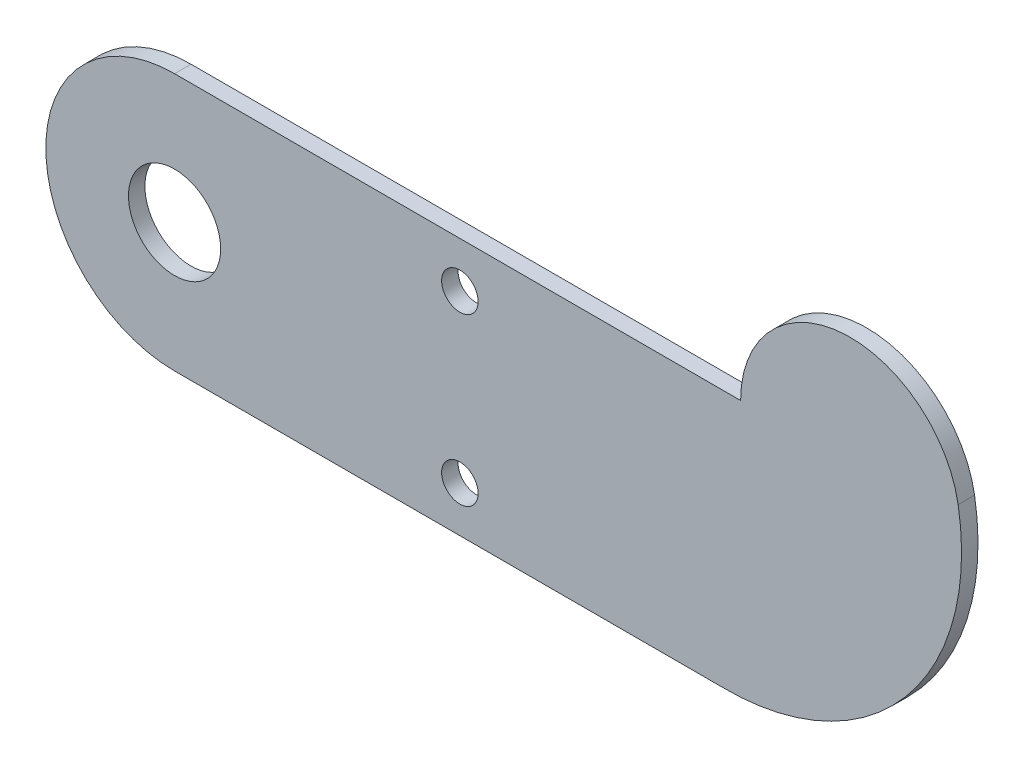
ISO-10303-21;
HEADER;
FILE_DESCRIPTION(('STEP AP214'),'2;1');
FILE_NAME('part.step','',(''),(''),'','','');
FILE_SCHEMA(('AUTOMOTIVE_DESIGN { 1 0 10303 214 1 1 1 1 }'));
ENDSEC;
DATA;
#1=APPLICATION_CONTEXT('core data for automotive mechanical design processes');
#2=APPLICATION_PROTOCOL_DEFINITION('international standard','automotive_design',2000,#1);
#3=PRODUCT_CONTEXT('',#1,'mechanical');
#4=PRODUCT('Part','Part','',(#3));
#5=PRODUCT_RELATED_PRODUCT_CATEGORY('part','',(#4));
#6=PRODUCT_DEFINITION_FORMATION('','',#4);
#7=PRODUCT_DEFINITION_CONTEXT('part definition',#1,'design');
#8=PRODUCT_DEFINITION('design','',#6,#7);
#9=PRODUCT_DEFINITION_SHAPE('','',#8);
#10=(LENGTH_UNIT() NAMED_UNIT(*) SI_UNIT(.MILLI.,.METRE.));
#11=(NAMED_UNIT(*) PLANE_ANGLE_UNIT() SI_UNIT($,.RADIAN.));
#12=(NAMED_UNIT(*) SI_UNIT($,.STERADIAN.) SOLID_ANGLE_UNIT());
#13=UNCERTAINTY_MEASURE_WITH_UNIT(LENGTH_MEASURE(1.E-05),#10,'distance_accuracy_value','');
#14=(GEOMETRIC_REPRESENTATION_CONTEXT(3) GLOBAL_UNCERTAINTY_ASSIGNED_CONTEXT((#13)) GLOBAL_UNIT_ASSIGNED_CONTEXT((#10,
#11,#12)) REPRESENTATION_CONTEXT('',''));
#15=CARTESIAN_POINT('',(0.,0.,0.));
#16=DIRECTION('',(0.,0.,1.));
#17=DIRECTION('',(1.,0.,0.));
#18=AXIS2_PLACEMENT_3D('',#15,#16,#17);
#19=CARTESIAN_POINT('',(0.,0.,1.8));
#20=DIRECTION('',(0.,0.,-1.));
#21=DIRECTION('',(-1.,0.,0.));
#22=AXIS2_PLACEMENT_3D('',#19,#20,#21);
#23=PLANE('',#22);
#24=CARTESIAN_POINT('',(0.,0.,1.8));
#25=DIRECTION('',(0.,0.,1.));
#26=DIRECTION('',(-1.,0.,0.));
#27=AXIS2_PLACEMENT_3D('',#24,#25,#26);
#28=CIRCLE('',#27,12.);
#29=CARTESIAN_POINT('',(11.8263011377595,2.0343552784675,1.8));
#30=VERTEX_POINT('',#29);
#31=CARTESIAN_POINT('',(-12.,0.,1.8));
#32=VERTEX_POINT('',#31);
#33=EDGE_CURVE('E135',#30,#32,#28,.T.);
#34=ORIENTED_EDGE('',*,*,#33,.T.);
#35=DIRECTION('',(-1.,0.,0.));
#36=VECTOR('',#35,1.);
#37=CARTESIAN_POINT('',(-12.,0.,1.8));
#38=LINE('',#37,#36);
#39=CARTESIAN_POINT('',(-74.,0.,1.8));
#40=VERTEX_POINT('',#39);
#41=EDGE_CURVE('E92',#32,#40,#38,.T.);
#42=ORIENTED_EDGE('',*,*,#41,.T.);
#43=CARTESIAN_POINT('',(-74.,-14.1,1.8));
#44=DIRECTION('',(0.,0.,1.));
#45=DIRECTION('',(1.,0.,0.));
#46=AXIS2_PLACEMENT_3D('',#43,#44,#45);
#47=CIRCLE('',#46,14.1);
#48=CARTESIAN_POINT('',(-74.,-28.2,1.8));
#49=VERTEX_POINT('',#48);
#50=EDGE_CURVE('E96',#40,#49,#47,.T.);
#51=ORIENTED_EDGE('',*,*,#50,.T.);
#52=DIRECTION('',(1.,0.,0.));
#53=VECTOR('',#52,1.);
#54=CARTESIAN_POINT('',(-14.,-28.2,1.8));
#55=LINE('',#54,#53);
#56=CARTESIAN_POINT('',(-14.,-28.2,1.8));
#57=VERTEX_POINT('',#56);
#58=EDGE_CURVE('E100',#49,#57,#55,.T.);
#59=ORIENTED_EDGE('',*,*,#58,.T.);
#60=CARTESIAN_POINT('',(-13.6531808269559,-2.34861434354199,1.8));
#61=DIRECTION('',(0.,0.,1.));
#62=DIRECTION('',(-1.,0.,0.));
#63=AXIS2_PLACEMENT_3D('',#60,#61,#62);
#64=CIRCLE('',#63,25.8537119945611);
#65=EDGE_CURVE('E57',#57,#30,#64,.T.);
#66=ORIENTED_EDGE('',*,*,#65,.T.);
#67=EDGE_LOOP('',(#34,#42,#51,#59,#66));
#68=FACE_BOUND('',#67,.T.);
#69=CARTESIAN_POINT('',(-74.,-14.1,1.8));
#70=DIRECTION('',(0.,0.,1.));
#71=DIRECTION('',(1.,0.,0.));
#72=AXIS2_PLACEMENT_3D('',#69,#70,#71);
#73=CIRCLE('',#72,5.05);
#74=CARTESIAN_POINT('',(-68.95,-14.1,1.8));
#75=VERTEX_POINT('',#74);
#76=EDGE_CURVE('E126',#75,#75,#73,.T.);
#77=ORIENTED_EDGE('',*,*,#76,.F.);
#78=EDGE_LOOP('',(#77));
#79=FACE_BOUND('',#78,.T.);
#80=CARTESIAN_POINT('',(-42.75,-5.,1.8));
#81=DIRECTION('',(0.,0.,1.));
#82=DIRECTION('',(1.,0.,0.));
#83=AXIS2_PLACEMENT_3D('',#80,#81,#82);
#84=CIRCLE('',#83,2.);
#85=CARTESIAN_POINT('',(-40.75,-5.,1.8));
#86=VERTEX_POINT('',#85);
#87=EDGE_CURVE('E173',#86,#86,#84,.T.);
#88=ORIENTED_EDGE('',*,*,#87,.F.);
#89=EDGE_LOOP('',(#88));
#90=FACE_BOUND('',#89,.T.);
#91=CARTESIAN_POINT('',(-42.75,-23.2,1.8));
#92=DIRECTION('',(0.,0.,1.));
#93=DIRECTION('',(1.,0.,0.));
#94=AXIS2_PLACEMENT_3D('',#91,#92,#93);
#95=CIRCLE('',#94,2.);
#96=CARTESIAN_POINT('',(-40.75,-23.2,1.8));
#97=VERTEX_POINT('',#96);
#98=EDGE_CURVE('E162',#97,#97,#95,.T.);
#99=ORIENTED_EDGE('',*,*,#98,.F.);
#100=EDGE_LOOP('',(#99));
#101=FACE_BOUND('',#100,.T.);
#102=ADVANCED_FACE('F39',(#68,#79,#90,#101),#23,.F.);
#103=CARTESIAN_POINT('',(0.,0.,0.));
#104=DIRECTION('',(0.,0.,-1.));
#105=DIRECTION('',(-1.,0.,0.));
#106=AXIS2_PLACEMENT_3D('',#103,#104,#105);
#107=PLANE('',#106);
#108=CARTESIAN_POINT('',(0.,0.,0.));
#109=DIRECTION('',(0.,0.,-1.));
#110=DIRECTION('',(-1.,0.,0.));
#111=AXIS2_PLACEMENT_3D('',#108,#109,#110);
#112=CIRCLE('',#111,5.);
#113=CARTESIAN_POINT('',(-5.,0.,0.));
#114=VERTEX_POINT('',#113);
#115=EDGE_CURVE('E11',#114,#114,#112,.T.);
#116=ORIENTED_EDGE('',*,*,#115,.F.);
#117=EDGE_LOOP('',(#116));
#118=FACE_BOUND('',#117,.T.);
#119=CARTESIAN_POINT('',(-42.75,-5.,0.));
#120=DIRECTION('',(0.,0.,1.));
#121=DIRECTION('',(1.,0.,0.));
#122=AXIS2_PLACEMENT_3D('',#119,#120,#121);
#123=CIRCLE('',#122,2.);
#124=CARTESIAN_POINT('',(-40.75,-5.,0.));
#125=VERTEX_POINT('',#124);
#126=EDGE_CURVE('E168',#125,#125,#123,.T.);
#127=ORIENTED_EDGE('',*,*,#126,.T.);
#128=EDGE_LOOP('',(#127));
#129=FACE_BOUND('',#128,.T.);
#130=CARTESIAN_POINT('',(0.,0.,0.));
#131=DIRECTION('',(0.,0.,1.));
#132=DIRECTION('',(-1.,0.,0.));
#133=AXIS2_PLACEMENT_3D('',#130,#131,#132);
#134=CIRCLE('',#133,12.);
#135=CARTESIAN_POINT('',(11.8263011377595,2.0343552784675,0.));
#136=VERTEX_POINT('',#135);
#137=CARTESIAN_POINT('',(-12.,0.,0.));
#138=VERTEX_POINT('',#137);
#139=EDGE_CURVE('E121',#136,#138,#134,.T.);
#140=ORIENTED_EDGE('',*,*,#139,.F.);
#141=CARTESIAN_POINT('',(-13.6531808269559,-2.34861434354199,0.));
#142=DIRECTION('',(0.,0.,1.));
#143=DIRECTION('',(-1.,0.,0.));
#144=AXIS2_PLACEMENT_3D('',#141,#142,#143);
#145=CIRCLE('',#144,25.8537119945611);
#146=CARTESIAN_POINT('',(-14.,-28.2,0.));
#147=VERTEX_POINT('',#146);
#148=EDGE_CURVE('E83',#147,#136,#145,.T.);
#149=ORIENTED_EDGE('',*,*,#148,.F.);
#150=DIRECTION('',(1.,0.,0.));
#151=VECTOR('',#150,1.);
#152=CARTESIAN_POINT('',(-14.,-28.2,0.));
#153=LINE('',#152,#151);
#154=CARTESIAN_POINT('',(-74.,-28.2,0.));
#155=VERTEX_POINT('',#154);
#156=EDGE_CURVE('E77',#155,#147,#153,.T.);
#157=ORIENTED_EDGE('',*,*,#156,.F.);
#158=CARTESIAN_POINT('',(-74.,-14.1,0.));
#159=DIRECTION('',(0.,0.,1.));
#160=DIRECTION('',(1.,0.,0.));
#161=AXIS2_PLACEMENT_3D('',#158,#159,#160);
#162=CIRCLE('',#161,14.1);
#163=CARTESIAN_POINT('',(-74.,0.,0.));
#164=VERTEX_POINT('',#163);
#165=EDGE_CURVE('E108',#164,#155,#162,.T.);
#166=ORIENTED_EDGE('',*,*,#165,.F.);
#167=DIRECTION('',(-1.,0.,0.));
#168=VECTOR('',#167,1.);
#169=CARTESIAN_POINT('',(-12.,0.,0.));
#170=LINE('',#169,#168);
#171=EDGE_CURVE('E125',#138,#164,#170,.T.);
#172=ORIENTED_EDGE('',*,*,#171,.F.);
#173=EDGE_LOOP('',(#140,#149,#157,#166,#172));
#174=FACE_BOUND('',#173,.T.);
#175=CARTESIAN_POINT('',(-74.,-14.1,0.));
#176=DIRECTION('',(0.,0.,1.));
#177=DIRECTION('',(1.,0.,0.));
#178=AXIS2_PLACEMENT_3D('',#175,#176,#177);
#179=CIRCLE('',#178,5.05);
#180=CARTESIAN_POINT('',(-68.95,-14.1,0.));
#181=VERTEX_POINT('',#180);
#182=EDGE_CURVE('E156',#181,#181,#179,.T.);
#183=ORIENTED_EDGE('',*,*,#182,.T.);
#184=EDGE_LOOP('',(#183));
#185=FACE_BOUND('',#184,.T.);
#186=CARTESIAN_POINT('',(-42.75,-23.2,0.));
#187=DIRECTION('',(0.,0.,1.));
#188=DIRECTION('',(1.,0.,0.));
#189=AXIS2_PLACEMENT_3D('',#186,#187,#188);
#190=CIRCLE('',#189,2.);
#191=CARTESIAN_POINT('',(-40.75,-23.2,0.));
#192=VERTEX_POINT('',#191);
#193=EDGE_CURVE('E159',#192,#192,#190,.T.);
#194=ORIENTED_EDGE('',*,*,#193,.T.);
#195=EDGE_LOOP('',(#194));
#196=FACE_BOUND('',#195,.T.);
#197=ADVANCED_FACE('F148',(#118,#129,#174,#185,#196),#107,.T.);
#198=CARTESIAN_POINT('',(0.,0.,1.8));
#199=DIRECTION('',(0.,0.,-1.));
#200=DIRECTION('',(-1.,0.,0.));
#201=AXIS2_PLACEMENT_3D('',#198,#199,#200);
#202=CYLINDRICAL_SURFACE('',#201,12.);
#203=ORIENTED_EDGE('',*,*,#139,.T.);
#204=DIRECTION('',(0.,0.,-1.));
#205=VECTOR('',#204,1.);
#206=CARTESIAN_POINT('',(-12.,0.,1.8));
#207=LINE('',#206,#205);
#208=EDGE_CURVE('E49',#32,#138,#207,.T.);
#209=ORIENTED_EDGE('',*,*,#208,.F.);
#210=ORIENTED_EDGE('',*,*,#33,.F.);
#211=DIRECTION('',(0.,0.,-1.));
#212=VECTOR('',#211,1.);
#213=CARTESIAN_POINT('',(11.8263011377595,2.0343552784675,1.8));
#214=LINE('',#213,#212);
#215=EDGE_CURVE('E117',#30,#136,#214,.T.);
#216=ORIENTED_EDGE('',*,*,#215,.T.);
#217=EDGE_LOOP('',(#203,#209,#210,#216));
#218=FACE_BOUND('',#217,.T.);
#219=ADVANCED_FACE('F41',(#218),#202,.T.);
#220=CARTESIAN_POINT('',(-12.,0.,1.8));
#221=DIRECTION('',(0.,-1.,0.));
#222=DIRECTION('',(1.,0.,0.));
#223=AXIS2_PLACEMENT_3D('',#220,#221,#222);
#224=PLANE('',#223);
#225=ORIENTED_EDGE('',*,*,#171,.T.);
#226=DIRECTION('',(0.,0.,-1.));
#227=VECTOR('',#226,1.);
#228=CARTESIAN_POINT('',(-74.,0.,1.8));
#229=LINE('',#228,#227);
#230=EDGE_CURVE('E110',#40,#164,#229,.T.);
#231=ORIENTED_EDGE('',*,*,#230,.F.);
#232=ORIENTED_EDGE('',*,*,#41,.F.);
#233=ORIENTED_EDGE('',*,*,#208,.T.);
#234=EDGE_LOOP('',(#225,#231,#232,#233));
#235=FACE_BOUND('',#234,.T.);
#236=ADVANCED_FACE('F143',(#235),#224,.F.);
#237=CARTESIAN_POINT('',(-74.,-14.1,1.8));
#238=DIRECTION('',(0.,0.,-1.));
#239=DIRECTION('',(-1.,0.,0.));
#240=AXIS2_PLACEMENT_3D('',#237,#238,#239);
#241=CYLINDRICAL_SURFACE('',#240,14.1);
#242=ORIENTED_EDGE('',*,*,#165,.T.);
#243=DIRECTION('',(0.,0.,-1.));
#244=VECTOR('',#243,1.);
#245=CARTESIAN_POINT('',(-74.,-28.2,1.8));
#246=LINE('',#245,#244);
#247=EDGE_CURVE('E105',#49,#155,#246,.T.);
#248=ORIENTED_EDGE('',*,*,#247,.F.);
#249=ORIENTED_EDGE('',*,*,#50,.F.);
#250=ORIENTED_EDGE('',*,*,#230,.T.);
#251=EDGE_LOOP('',(#242,#248,#249,#250));
#252=FACE_BOUND('',#251,.T.);
#253=ADVANCED_FACE('F106',(#252),#241,.T.);
#254=CARTESIAN_POINT('',(-14.,-28.2,1.8));
#255=DIRECTION('',(0.,1.,0.));
#256=DIRECTION('',(-1.,0.,0.));
#257=AXIS2_PLACEMENT_3D('',#254,#255,#256);
#258=PLANE('',#257);
#259=ORIENTED_EDGE('',*,*,#156,.T.);
#260=DIRECTION('',(0.,0.,-1.));
#261=VECTOR('',#260,1.);
#262=CARTESIAN_POINT('',(-14.,-28.2,1.8));
#263=LINE('',#262,#261);
#264=EDGE_CURVE('E111',#57,#147,#263,.T.);
#265=ORIENTED_EDGE('',*,*,#264,.F.);
#266=ORIENTED_EDGE('',*,*,#58,.F.);
#267=ORIENTED_EDGE('',*,*,#247,.T.);
#268=EDGE_LOOP('',(#259,#265,#266,#267));
#269=FACE_BOUND('',#268,.T.);
#270=ADVANCED_FACE('F113',(#269),#258,.F.);
#271=CARTESIAN_POINT('',(-13.6531808269559,-2.34861434354199,1.8));
#272=DIRECTION('',(0.,0.,-1.));
#273=DIRECTION('',(-1.,0.,0.));
#274=AXIS2_PLACEMENT_3D('',#271,#272,#273);
#275=CYLINDRICAL_SURFACE('',#274,25.8537119945611);
#276=ORIENTED_EDGE('',*,*,#148,.T.);
#277=ORIENTED_EDGE('',*,*,#215,.F.);
#278=ORIENTED_EDGE('',*,*,#65,.F.);
#279=ORIENTED_EDGE('',*,*,#264,.T.);
#280=EDGE_LOOP('',(#276,#277,#278,#279));
#281=FACE_BOUND('',#280,.T.);
#282=ADVANCED_FACE('F215',(#281),#275,.T.);
#283=CARTESIAN_POINT('',(-74.,-14.1,1.8));
#284=DIRECTION('',(0.,0.,-1.));
#285=DIRECTION('',(-1.,0.,0.));
#286=AXIS2_PLACEMENT_3D('',#283,#284,#285);
#287=CYLINDRICAL_SURFACE('',#286,5.05);
#288=ORIENTED_EDGE('',*,*,#76,.T.);
#289=EDGE_LOOP('',(#288));
#290=FACE_BOUND('',#289,.T.);
#291=ORIENTED_EDGE('',*,*,#182,.F.);
#292=EDGE_LOOP('',(#291));
#293=FACE_BOUND('',#292,.T.);
#294=ADVANCED_FACE('F189',(#290,#293),#287,.F.);
#295=CARTESIAN_POINT('',(-42.75,-5.,1.8));
#296=DIRECTION('',(0.,0.,-1.));
#297=DIRECTION('',(-1.,0.,0.));
#298=AXIS2_PLACEMENT_3D('',#295,#296,#297);
#299=CYLINDRICAL_SURFACE('',#298,2.);
#300=ORIENTED_EDGE('',*,*,#87,.T.);
#301=EDGE_LOOP('',(#300));
#302=FACE_BOUND('',#301,.T.);
#303=ORIENTED_EDGE('',*,*,#126,.F.);
#304=EDGE_LOOP('',(#303));
#305=FACE_BOUND('',#304,.T.);
#306=ADVANCED_FACE('F201',(#302,#305),#299,.F.);
#307=CARTESIAN_POINT('',(-42.75,-23.2,1.8));
#308=DIRECTION('',(0.,0.,-1.));
#309=DIRECTION('',(-1.,0.,0.));
#310=AXIS2_PLACEMENT_3D('',#307,#308,#309);
#311=CYLINDRICAL_SURFACE('',#310,2.);
#312=ORIENTED_EDGE('',*,*,#98,.T.);
#313=EDGE_LOOP('',(#312));
#314=FACE_BOUND('',#313,.T.);
#315=ORIENTED_EDGE('',*,*,#193,.F.);
#316=EDGE_LOOP('',(#315));
#317=FACE_BOUND('',#316,.T.);
#318=ADVANCED_FACE('F198',(#314,#317),#311,.F.);
#319=CARTESIAN_POINT('',(0.,0.,-1.8));
#320=DIRECTION('',(0.,0.,1.));
#321=DIRECTION('',(1.,0.,0.));
#322=AXIS2_PLACEMENT_3D('',#319,#320,#321);
#323=CYLINDRICAL_SURFACE('',#322,5.);
#324=CARTESIAN_POINT('',(0.,0.,-1.8));
#325=DIRECTION('',(0.,0.,1.));
#326=DIRECTION('',(1.,0.,0.));
#327=AXIS2_PLACEMENT_3D('',#324,#325,#326);
#328=CIRCLE('',#327,5.);
#329=CARTESIAN_POINT('',(5.,0.,-1.8));
#330=VERTEX_POINT('',#329);
#331=EDGE_CURVE('E163',#330,#330,#328,.T.);
#332=ORIENTED_EDGE('',*,*,#331,.T.);
#333=EDGE_LOOP('',(#332));
#334=FACE_BOUND('',#333,.T.);
#335=ORIENTED_EDGE('',*,*,#115,.T.);
#336=EDGE_LOOP('',(#335));
#337=FACE_BOUND('',#336,.T.);
#338=ADVANCED_FACE('F200',(#334,#337),#323,.T.);
#339=CARTESIAN_POINT('',(0.,0.,-1.8));
#340=DIRECTION('',(0.,0.,1.));
#341=DIRECTION('',(1.,0.,0.));
#342=AXIS2_PLACEMENT_3D('',#339,#340,#341);
#343=PLANE('',#342);
#344=ORIENTED_EDGE('',*,*,#331,.F.);
#345=EDGE_LOOP('',(#344));
#346=FACE_BOUND('',#345,.T.);
#347=ADVANCED_FACE('F207',(#346),#343,.F.);
#348=CLOSED_SHELL('',(#102,#197,#219,#236,#253,#270,#282,#294,#306,#318,#338,#347));
#349=MANIFOLD_SOLID_BREP('B2',#348);
#350=ADVANCED_BREP_SHAPE_REPRESENTATION('',(#18,#349),#14);
#351=SHAPE_DEFINITION_REPRESENTATION(#9,#350);
ENDSEC;
END-ISO-10303-21;
